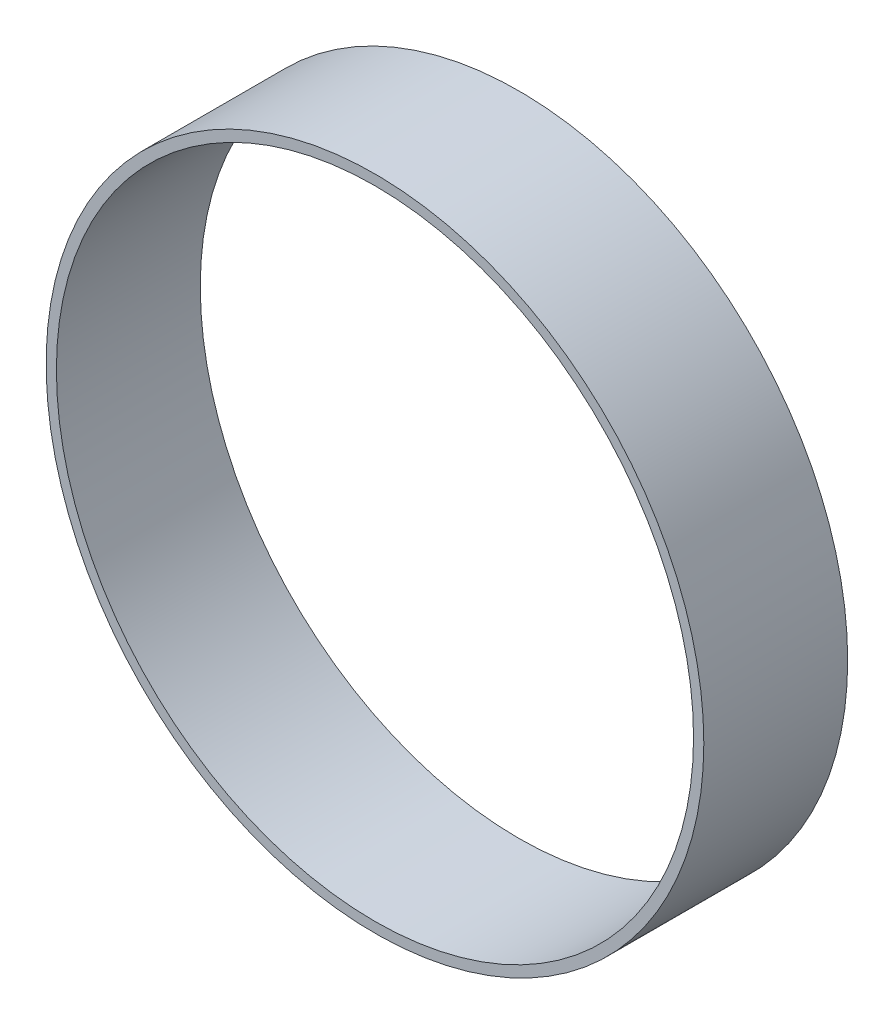
ISO-10303-21;
HEADER;
FILE_DESCRIPTION(('STEP AP214'),'2;1');
FILE_NAME('part.step','',(''),(''),'','','');
FILE_SCHEMA(('AUTOMOTIVE_DESIGN { 1 0 10303 214 1 1 1 1 }'));
ENDSEC;
DATA;
#1=APPLICATION_CONTEXT('core data for automotive mechanical design processes');
#2=APPLICATION_PROTOCOL_DEFINITION('international standard','automotive_design',2000,#1);
#3=PRODUCT_CONTEXT('',#1,'mechanical');
#4=PRODUCT('Part','Part','',(#3));
#5=PRODUCT_RELATED_PRODUCT_CATEGORY('part','',(#4));
#6=PRODUCT_DEFINITION_FORMATION('','',#4);
#7=PRODUCT_DEFINITION_CONTEXT('part definition',#1,'design');
#8=PRODUCT_DEFINITION('design','',#6,#7);
#9=PRODUCT_DEFINITION_SHAPE('','',#8);
#10=(LENGTH_UNIT() NAMED_UNIT(*) SI_UNIT(.MILLI.,.METRE.));
#11=(NAMED_UNIT(*) PLANE_ANGLE_UNIT() SI_UNIT($,.RADIAN.));
#12=(NAMED_UNIT(*) SI_UNIT($,.STERADIAN.) SOLID_ANGLE_UNIT());
#13=UNCERTAINTY_MEASURE_WITH_UNIT(LENGTH_MEASURE(1.E-05),#10,'distance_accuracy_value','');
#14=(GEOMETRIC_REPRESENTATION_CONTEXT(3) GLOBAL_UNCERTAINTY_ASSIGNED_CONTEXT((#13)) GLOBAL_UNIT_ASSIGNED_CONTEXT((#10,
#11,#12)) REPRESENTATION_CONTEXT('',''));
#15=CARTESIAN_POINT('',(0.,0.,0.));
#16=DIRECTION('',(0.,0.,1.));
#17=DIRECTION('',(1.,0.,0.));
#18=AXIS2_PLACEMENT_3D('',#15,#16,#17);
#19=CARTESIAN_POINT('',(0.,0.,22.225));
#20=DIRECTION('',(0.,0.,1.));
#21=DIRECTION('',(1.,0.,0.));
#22=AXIS2_PLACEMENT_3D('',#19,#20,#21);
#23=PLANE('',#22);
#24=CARTESIAN_POINT('',(0.,0.,22.225));
#25=DIRECTION('',(0.,0.,1.));
#26=DIRECTION('',(1.,0.,0.));
#27=AXIS2_PLACEMENT_3D('',#24,#25,#26);
#28=CIRCLE('',#27,50.8);
#29=CARTESIAN_POINT('',(50.8,0.,22.225));
#30=VERTEX_POINT('',#29);
#31=EDGE_CURVE('E10',#30,#30,#28,.T.);
#32=ORIENTED_EDGE('',*,*,#31,.T.);
#33=EDGE_LOOP('',(#32));
#34=FACE_BOUND('',#33,.T.);
#35=CARTESIAN_POINT('',(0.,0.,22.225));
#36=DIRECTION('',(0.,0.,1.));
#37=DIRECTION('',(1.,0.,0.));
#38=AXIS2_PLACEMENT_3D('',#35,#36,#37);
#39=CIRCLE('',#38,49.2125);
#40=CARTESIAN_POINT('',(49.2125,0.,22.225));
#41=VERTEX_POINT('',#40);
#42=EDGE_CURVE('E42',#41,#41,#39,.T.);
#43=ORIENTED_EDGE('',*,*,#42,.F.);
#44=EDGE_LOOP('',(#43));
#45=FACE_BOUND('',#44,.T.);
#46=ADVANCED_FACE('F31',(#34,#45),#23,.T.);
#47=CARTESIAN_POINT('',(0.,0.,0.));
#48=DIRECTION('',(0.,0.,1.));
#49=DIRECTION('',(1.,0.,0.));
#50=AXIS2_PLACEMENT_3D('',#47,#48,#49);
#51=PLANE('',#50);
#52=CARTESIAN_POINT('',(0.,0.,0.));
#53=DIRECTION('',(0.,0.,1.));
#54=DIRECTION('',(1.,0.,0.));
#55=AXIS2_PLACEMENT_3D('',#52,#53,#54);
#56=CIRCLE('',#55,50.8);
#57=CARTESIAN_POINT('',(50.8,0.,0.));
#58=VERTEX_POINT('',#57);
#59=EDGE_CURVE('E35',#58,#58,#56,.T.);
#60=ORIENTED_EDGE('',*,*,#59,.F.);
#61=EDGE_LOOP('',(#60));
#62=FACE_BOUND('',#61,.T.);
#63=CARTESIAN_POINT('',(0.,0.,0.));
#64=DIRECTION('',(0.,0.,1.));
#65=DIRECTION('',(1.,0.,0.));
#66=AXIS2_PLACEMENT_3D('',#63,#64,#65);
#67=CIRCLE('',#66,49.2125);
#68=CARTESIAN_POINT('',(49.2125,0.,0.));
#69=VERTEX_POINT('',#68);
#70=EDGE_CURVE('E44',#69,#69,#67,.T.);
#71=ORIENTED_EDGE('',*,*,#70,.T.);
#72=EDGE_LOOP('',(#71));
#73=FACE_BOUND('',#72,.T.);
#74=ADVANCED_FACE('F54',(#62,#73),#51,.F.);
#75=CARTESIAN_POINT('',(0.,0.,22.225));
#76=DIRECTION('',(0.,0.,-1.));
#77=DIRECTION('',(-1.,0.,0.));
#78=AXIS2_PLACEMENT_3D('',#75,#76,#77);
#79=CYLINDRICAL_SURFACE('',#78,50.8);
#80=ORIENTED_EDGE('',*,*,#31,.F.);
#81=EDGE_LOOP('',(#80));
#82=FACE_BOUND('',#81,.T.);
#83=ORIENTED_EDGE('',*,*,#59,.T.);
#84=EDGE_LOOP('',(#83));
#85=FACE_BOUND('',#84,.T.);
#86=ADVANCED_FACE('F33',(#82,#85),#79,.T.);
#87=CARTESIAN_POINT('',(0.,0.,22.225));
#88=DIRECTION('',(0.,0.,-1.));
#89=DIRECTION('',(-1.,0.,0.));
#90=AXIS2_PLACEMENT_3D('',#87,#88,#89);
#91=CYLINDRICAL_SURFACE('',#90,49.2125);
#92=ORIENTED_EDGE('',*,*,#42,.T.);
#93=EDGE_LOOP('',(#92));
#94=FACE_BOUND('',#93,.T.);
#95=ORIENTED_EDGE('',*,*,#70,.F.);
#96=EDGE_LOOP('',(#95));
#97=FACE_BOUND('',#96,.T.);
#98=ADVANCED_FACE('F50',(#94,#97),#91,.F.);
#99=CLOSED_SHELL('',(#46,#74,#86,#98));
#100=MANIFOLD_SOLID_BREP('B2',#99);
#101=ADVANCED_BREP_SHAPE_REPRESENTATION('',(#18,#100),#14);
#102=SHAPE_DEFINITION_REPRESENTATION(#9,#101);
ENDSEC;
END-ISO-10303-21;
